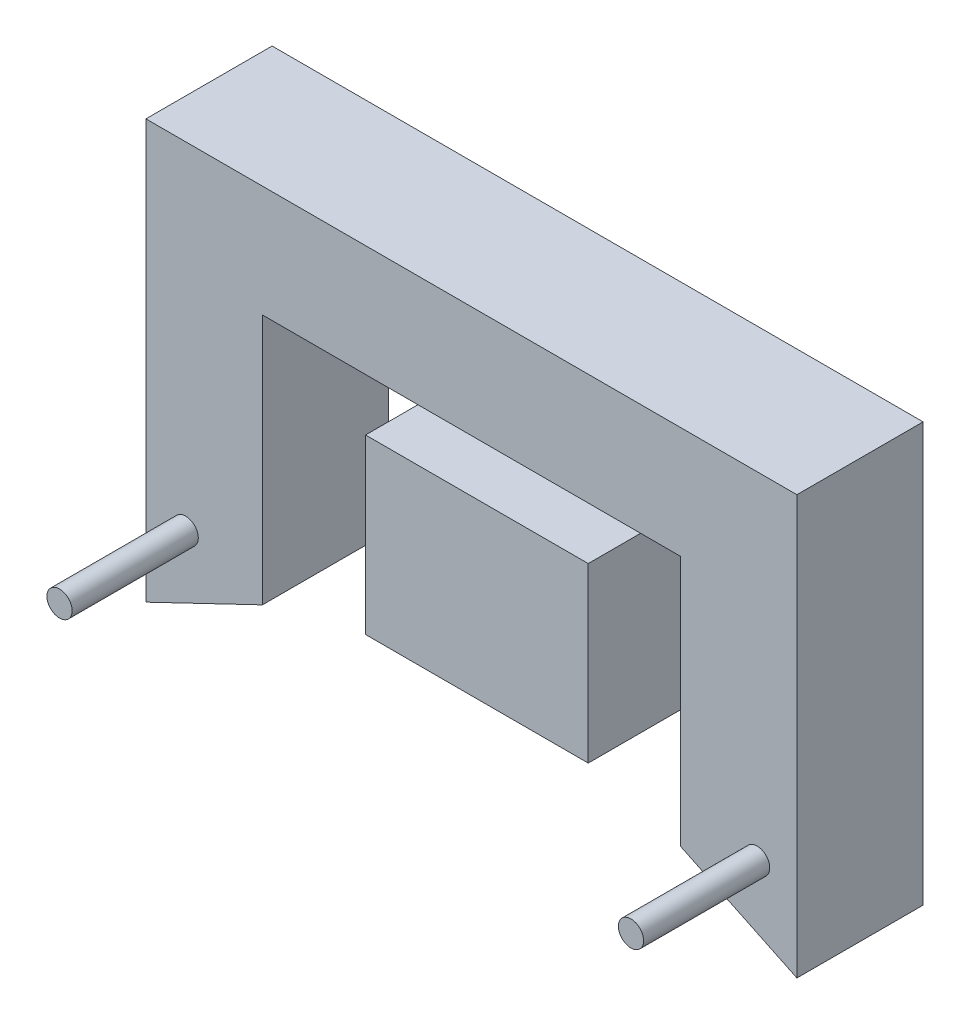
ISO-10303-21;
HEADER;
FILE_DESCRIPTION(('STEP AP214'),'2;1');
FILE_NAME('part.step','',(''),(''),'','','');
FILE_SCHEMA(('AUTOMOTIVE_DESIGN { 1 0 10303 214 1 1 1 1 }'));
ENDSEC;
DATA;
#1=APPLICATION_CONTEXT('core data for automotive mechanical design processes');
#2=APPLICATION_PROTOCOL_DEFINITION('international standard','automotive_design',2000,#1);
#3=PRODUCT_CONTEXT('',#1,'mechanical');
#4=PRODUCT('Part','Part','',(#3));
#5=PRODUCT_RELATED_PRODUCT_CATEGORY('part','',(#4));
#6=PRODUCT_DEFINITION_FORMATION('','',#4);
#7=PRODUCT_DEFINITION_CONTEXT('part definition',#1,'design');
#8=PRODUCT_DEFINITION('design','',#6,#7);
#9=PRODUCT_DEFINITION_SHAPE('','',#8);
#10=(LENGTH_UNIT() NAMED_UNIT(*) SI_UNIT(.MILLI.,.METRE.));
#11=(NAMED_UNIT(*) PLANE_ANGLE_UNIT() SI_UNIT($,.RADIAN.));
#12=(NAMED_UNIT(*) SI_UNIT($,.STERADIAN.) SOLID_ANGLE_UNIT());
#13=UNCERTAINTY_MEASURE_WITH_UNIT(LENGTH_MEASURE(1.E-05),#10,'distance_accuracy_value','');
#14=(GEOMETRIC_REPRESENTATION_CONTEXT(3) GLOBAL_UNCERTAINTY_ASSIGNED_CONTEXT((#13)) GLOBAL_UNIT_ASSIGNED_CONTEXT((#10,
#11,#12)) REPRESENTATION_CONTEXT('',''));
#15=CARTESIAN_POINT('',(0.,0.,0.));
#16=DIRECTION('',(0.,0.,1.));
#17=DIRECTION('',(1.,0.,0.));
#18=AXIS2_PLACEMENT_3D('',#15,#16,#17);
#19=CARTESIAN_POINT('',(-150.878326632198,35.1271833279846,20.));
#20=DIRECTION('',(1.,0.,0.));
#21=DIRECTION('',(0.,0.,-1.));
#22=AXIS2_PLACEMENT_3D('',#19,#20,#21);
#23=PLANE('',#22);
#24=DIRECTION('',(0.,-1.,0.));
#25=VECTOR('',#24,1.);
#26=CARTESIAN_POINT('',(-150.878326632198,35.1271833279846,0.));
#27=LINE('',#26,#25);
#28=CARTESIAN_POINT('',(-150.878326632198,35.1271833279846,0.));
#29=VERTEX_POINT('',#28);
#30=CARTESIAN_POINT('',(-150.878326632198,7.73369103403253,0.));
#31=VERTEX_POINT('',#30);
#32=EDGE_CURVE('E161',#29,#31,#27,.T.);
#33=ORIENTED_EDGE('',*,*,#32,.T.);
#34=DIRECTION('',(0.,0.,-1.));
#35=VECTOR('',#34,1.);
#36=CARTESIAN_POINT('',(-150.878326632198,7.73369103403253,20.));
#37=LINE('',#36,#35);
#38=CARTESIAN_POINT('',(-150.878326632198,7.73369103403253,20.));
#39=VERTEX_POINT('',#38);
#40=EDGE_CURVE('E13',#39,#31,#37,.T.);
#41=ORIENTED_EDGE('',*,*,#40,.F.);
#42=DIRECTION('',(0.,-1.,0.));
#43=VECTOR('',#42,1.);
#44=CARTESIAN_POINT('',(-150.878326632198,35.1271833279846,20.));
#45=LINE('',#44,#43);
#46=CARTESIAN_POINT('',(-150.878326632198,35.1271833279846,20.));
#47=VERTEX_POINT('',#46);
#48=EDGE_CURVE('E147',#47,#39,#45,.T.);
#49=ORIENTED_EDGE('',*,*,#48,.F.);
#50=DIRECTION('',(0.,0.,-1.));
#51=VECTOR('',#50,1.);
#52=CARTESIAN_POINT('',(-150.878326632198,35.1271833279846,20.));
#53=LINE('',#52,#51);
#54=EDGE_CURVE('E114',#47,#29,#53,.T.);
#55=ORIENTED_EDGE('',*,*,#54,.T.);
#56=EDGE_LOOP('',(#33,#41,#49,#55));
#57=FACE_BOUND('',#56,.T.);
#58=ADVANCED_FACE('F98',(#57),#23,.F.);
#59=CARTESIAN_POINT('',(-150.878326632198,7.73369103403253,20.));
#60=DIRECTION('',(0.,1.,0.));
#61=DIRECTION('',(0.,0.,1.));
#62=AXIS2_PLACEMENT_3D('',#59,#60,#61);
#63=PLANE('',#62);
#64=DIRECTION('',(1.,0.,0.));
#65=VECTOR('',#64,1.);
#66=CARTESIAN_POINT('',(-150.878326632198,7.73369103403253,0.));
#67=LINE('',#66,#65);
#68=CARTESIAN_POINT('',(-115.579705041076,7.73369103403253,0.));
#69=VERTEX_POINT('',#68);
#70=EDGE_CURVE('E152',#31,#69,#67,.T.);
#71=ORIENTED_EDGE('',*,*,#70,.T.);
#72=DIRECTION('',(0.,0.,-1.));
#73=VECTOR('',#72,1.);
#74=CARTESIAN_POINT('',(-115.579705041076,7.73369103403253,20.));
#75=LINE('',#74,#73);
#76=CARTESIAN_POINT('',(-115.579705041076,7.73369103403253,20.));
#77=VERTEX_POINT('',#76);
#78=EDGE_CURVE('E106',#77,#69,#75,.T.);
#79=ORIENTED_EDGE('',*,*,#78,.F.);
#80=DIRECTION('',(1.,0.,0.));
#81=VECTOR('',#80,1.);
#82=CARTESIAN_POINT('',(-150.878326632198,7.73369103403253,20.));
#83=LINE('',#82,#81);
#84=EDGE_CURVE('E139',#39,#77,#83,.T.);
#85=ORIENTED_EDGE('',*,*,#84,.F.);
#86=ORIENTED_EDGE('',*,*,#40,.T.);
#87=EDGE_LOOP('',(#71,#79,#85,#86));
#88=FACE_BOUND('',#87,.T.);
#89=ADVANCED_FACE('F151',(#88),#63,.F.);
#90=CARTESIAN_POINT('',(-115.579705041076,35.1271833279846,20.));
#91=DIRECTION('',(1.,0.,0.));
#92=DIRECTION('',(0.,0.,-1.));
#93=AXIS2_PLACEMENT_3D('',#90,#91,#92);
#94=PLANE('',#93);
#95=DIRECTION('',(0.,-1.,0.));
#96=VECTOR('',#95,1.);
#97=CARTESIAN_POINT('',(-115.579705041076,35.1271833279846,0.));
#98=LINE('',#97,#96);
#99=CARTESIAN_POINT('',(-115.579705041076,35.1271833279846,0.));
#100=VERTEX_POINT('',#99);
#101=EDGE_CURVE('E164',#100,#69,#98,.T.);
#102=ORIENTED_EDGE('',*,*,#101,.F.);
#103=DIRECTION('',(0.,0.,-1.));
#104=VECTOR('',#103,1.);
#105=CARTESIAN_POINT('',(-115.579705041076,35.1271833279846,20.));
#106=LINE('',#105,#104);
#107=CARTESIAN_POINT('',(-115.579705041076,35.1271833279846,20.));
#108=VERTEX_POINT('',#107);
#109=EDGE_CURVE('E128',#108,#100,#106,.T.);
#110=ORIENTED_EDGE('',*,*,#109,.F.);
#111=DIRECTION('',(0.,-1.,0.));
#112=VECTOR('',#111,1.);
#113=CARTESIAN_POINT('',(-115.579705041076,35.1271833279846,20.));
#114=LINE('',#113,#112);
#115=EDGE_CURVE('E146',#108,#77,#114,.T.);
#116=ORIENTED_EDGE('',*,*,#115,.T.);
#117=ORIENTED_EDGE('',*,*,#78,.T.);
#118=EDGE_LOOP('',(#102,#110,#116,#117));
#119=FACE_BOUND('',#118,.T.);
#120=ADVANCED_FACE('F155',(#119),#94,.T.);
#121=CARTESIAN_POINT('',(-150.878326632198,35.1271833279846,20.));
#122=DIRECTION('',(0.,1.,0.));
#123=DIRECTION('',(0.,0.,1.));
#124=AXIS2_PLACEMENT_3D('',#121,#122,#123);
#125=PLANE('',#124);
#126=DIRECTION('',(1.,0.,0.));
#127=VECTOR('',#126,1.);
#128=CARTESIAN_POINT('',(-150.878326632198,35.1271833279846,0.));
#129=LINE('',#128,#127);
#130=EDGE_CURVE('E166',#29,#100,#129,.T.);
#131=ORIENTED_EDGE('',*,*,#130,.F.);
#132=ORIENTED_EDGE('',*,*,#54,.F.);
#133=DIRECTION('',(1.,0.,0.));
#134=VECTOR('',#133,1.);
#135=CARTESIAN_POINT('',(-150.878326632198,35.1271833279846,20.));
#136=LINE('',#135,#134);
#137=EDGE_CURVE('E156',#47,#108,#136,.T.);
#138=ORIENTED_EDGE('',*,*,#137,.T.);
#139=ORIENTED_EDGE('',*,*,#109,.T.);
#140=EDGE_LOOP('',(#131,#132,#138,#139));
#141=FACE_BOUND('',#140,.T.);
#142=ADVANCED_FACE('F172',(#141),#125,.T.);
#143=CARTESIAN_POINT('',(0.,0.,20.));
#144=DIRECTION('',(0.,0.,1.));
#145=DIRECTION('',(1.,0.,0.));
#146=AXIS2_PLACEMENT_3D('',#143,#144,#145);
#147=PLANE('',#146);
#148=ORIENTED_EDGE('',*,*,#48,.T.);
#149=ORIENTED_EDGE('',*,*,#84,.T.);
#150=ORIENTED_EDGE('',*,*,#115,.F.);
#151=ORIENTED_EDGE('',*,*,#137,.F.);
#152=EDGE_LOOP('',(#148,#149,#150,#151));
#153=FACE_BOUND('',#152,.T.);
#154=ADVANCED_FACE('F143',(#153),#147,.T.);
#155=CARTESIAN_POINT('',(0.,0.,0.));
#156=DIRECTION('',(0.,0.,1.));
#157=DIRECTION('',(1.,0.,0.));
#158=AXIS2_PLACEMENT_3D('',#155,#156,#157);
#159=PLANE('',#158);
#160=ORIENTED_EDGE('',*,*,#32,.F.);
#161=ORIENTED_EDGE('',*,*,#130,.T.);
#162=ORIENTED_EDGE('',*,*,#101,.T.);
#163=ORIENTED_EDGE('',*,*,#70,.F.);
#164=EDGE_LOOP('',(#160,#161,#162,#163));
#165=FACE_BOUND('',#164,.T.);
#166=ADVANCED_FACE('F171',(#165),#159,.F.);
#167=CLOSED_SHELL('',(#58,#89,#120,#142,#154,#166));
#168=MANIFOLD_SOLID_BREP('B2',#167);
#169=CARTESIAN_POINT('',(-88.8039762419996,7.73369103403253,40.));
#170=DIRECTION('',(0.,0.,-1.));
#171=DIRECTION('',(-1.,0.,0.));
#172=AXIS2_PLACEMENT_3D('',#169,#170,#171);
#173=CYLINDRICAL_SURFACE('',#172,2.00000000000001);
#174=CARTESIAN_POINT('',(-88.8039762419996,7.73369103403253,40.));
#175=DIRECTION('',(0.,0.,1.));
#176=DIRECTION('',(1.,0.,0.));
#177=AXIS2_PLACEMENT_3D('',#174,#175,#176);
#178=CIRCLE('',#177,2.00000000000001);
#179=CARTESIAN_POINT('',(-90.8039762419996,7.73369103403253,40.));
#180=VERTEX_POINT('',#179);
#181=EDGE_CURVE('E97',#180,#180,#178,.T.);
#182=CARTESIAN_POINT('',(-88.8039762419996,7.73369103403253,20.));
#183=DIRECTION('',(0.,0.,1.));
#184=DIRECTION('',(1.,0.,0.));
#185=AXIS2_PLACEMENT_3D('',#182,#183,#184);
#186=CIRCLE('',#185,2.00000000000001);
#187=CARTESIAN_POINT('',(-90.8039762419996,7.73369103403253,20.));
#188=VERTEX_POINT('',#187);
#189=EDGE_CURVE('E234',#188,#188,#186,.T.);
#190=CARTESIAN_POINT('',(-90.8039762419996,7.73369103403253,40.));
#191=CARTESIAN_POINT('',(-90.8039762419996,7.73369103403253,39.7916666666666));
#192=CARTESIAN_POINT('',(-90.8039762419996,7.73369103403253,39.5833333333333));
#193=CARTESIAN_POINT('',(-90.8039762419996,7.73369103403253,39.1666666666667));
#194=CARTESIAN_POINT('',(-90.8039762419996,7.73369103403253,38.9583333333333));
#195=CARTESIAN_POINT('',(-90.8039762419996,7.73369103403253,38.5416666666667));
#196=CARTESIAN_POINT('',(-90.8039762419996,7.73369103403253,38.3333333333333));
#197=CARTESIAN_POINT('',(-90.8039762419996,7.73369103403253,37.9166666666667));
#198=CARTESIAN_POINT('',(-90.8039762419996,7.73369103403253,37.7083333333333));
#199=CARTESIAN_POINT('',(-90.8039762419996,7.73369103403253,37.2916666666667));
#200=CARTESIAN_POINT('',(-90.8039762419996,7.73369103403253,37.0833333333333));
#201=CARTESIAN_POINT('',(-90.8039762419996,7.73369103403253,36.6666666666666));
#202=CARTESIAN_POINT('',(-90.8039762419996,7.73369103403253,36.4583333333333));
#203=CARTESIAN_POINT('',(-90.8039762419996,7.73369103403253,36.0416666666667));
#204=CARTESIAN_POINT('',(-90.8039762419996,7.73369103403253,35.8333333333333));
#205=CARTESIAN_POINT('',(-90.8039762419996,7.73369103403253,35.4166666666667));
#206=CARTESIAN_POINT('',(-90.8039762419996,7.73369103403253,35.2083333333333));
#207=CARTESIAN_POINT('',(-90.8039762419996,7.73369103403253,34.7916666666667));
#208=CARTESIAN_POINT('',(-90.8039762419996,7.73369103403253,34.5833333333333));
#209=CARTESIAN_POINT('',(-90.8039762419996,7.73369103403253,34.1666666666667));
#210=CARTESIAN_POINT('',(-90.8039762419996,7.73369103403253,33.9583333333333));
#211=CARTESIAN_POINT('',(-90.8039762419996,7.73369103403253,33.5416666666667));
#212=CARTESIAN_POINT('',(-90.8039762419996,7.73369103403253,33.3333333333333));
#213=CARTESIAN_POINT('',(-90.8039762419996,7.73369103403253,32.9166666666667));
#214=CARTESIAN_POINT('',(-90.8039762419996,7.73369103403253,32.7083333333333));
#215=CARTESIAN_POINT('',(-90.8039762419996,7.73369103403253,32.2916666666667));
#216=CARTESIAN_POINT('',(-90.8039762419996,7.73369103403253,32.0833333333333));
#217=CARTESIAN_POINT('',(-90.8039762419996,7.73369103403253,31.6666666666667));
#218=CARTESIAN_POINT('',(-90.8039762419996,7.73369103403253,31.4583333333333));
#219=CARTESIAN_POINT('',(-90.8039762419996,7.73369103403253,31.0416666666667));
#220=CARTESIAN_POINT('',(-90.8039762419996,7.73369103403253,30.8333333333333));
#221=CARTESIAN_POINT('',(-90.8039762419996,7.73369103403253,30.4166666666667));
#222=CARTESIAN_POINT('',(-90.8039762419996,7.73369103403253,30.2083333333333));
#223=CARTESIAN_POINT('',(-90.8039762419996,7.73369103403253,29.7916666666667));
#224=CARTESIAN_POINT('',(-90.8039762419996,7.73369103403253,29.5833333333333));
#225=CARTESIAN_POINT('',(-90.8039762419996,7.73369103403253,29.1666666666667));
#226=CARTESIAN_POINT('',(-90.8039762419996,7.73369103403253,28.9583333333333));
#227=CARTESIAN_POINT('',(-90.8039762419996,7.73369103403253,28.5416666666667));
#228=CARTESIAN_POINT('',(-90.8039762419996,7.73369103403253,28.3333333333333));
#229=CARTESIAN_POINT('',(-90.8039762419996,7.73369103403253,27.9166666666667));
#230=CARTESIAN_POINT('',(-90.8039762419996,7.73369103403253,27.7083333333333));
#231=CARTESIAN_POINT('',(-90.8039762419996,7.73369103403253,27.2916666666667));
#232=CARTESIAN_POINT('',(-90.8039762419996,7.73369103403253,27.0833333333333));
#233=CARTESIAN_POINT('',(-90.8039762419996,7.73369103403253,26.6666666666667));
#234=CARTESIAN_POINT('',(-90.8039762419996,7.73369103403253,26.4583333333333));
#235=CARTESIAN_POINT('',(-90.8039762419996,7.73369103403253,26.0416666666667));
#236=CARTESIAN_POINT('',(-90.8039762419996,7.73369103403253,25.8333333333333));
#237=CARTESIAN_POINT('',(-90.8039762419996,7.73369103403253,25.4166666666667));
#238=CARTESIAN_POINT('',(-90.8039762419996,7.73369103403253,25.2083333333333));
#239=CARTESIAN_POINT('',(-90.8039762419996,7.73369103403253,24.7916666666667));
#240=CARTESIAN_POINT('',(-90.8039762419996,7.73369103403253,24.5833333333333));
#241=CARTESIAN_POINT('',(-90.8039762419996,7.73369103403253,24.1666666666667));
#242=CARTESIAN_POINT('',(-90.8039762419996,7.73369103403253,23.9583333333333));
#243=CARTESIAN_POINT('',(-90.8039762419996,7.73369103403253,23.5416666666667));
#244=CARTESIAN_POINT('',(-90.8039762419996,7.73369103403253,23.3333333333333));
#245=CARTESIAN_POINT('',(-90.8039762419996,7.73369103403253,22.9166666666667));
#246=CARTESIAN_POINT('',(-90.8039762419996,7.73369103403253,22.7083333333333));
#247=CARTESIAN_POINT('',(-90.8039762419996,7.73369103403253,22.2916666666667));
#248=CARTESIAN_POINT('',(-90.8039762419996,7.73369103403253,22.0833333333333));
#249=CARTESIAN_POINT('',(-90.8039762419996,7.73369103403253,21.6666666666667));
#250=CARTESIAN_POINT('',(-90.8039762419996,7.73369103403253,21.4583333333333));
#251=CARTESIAN_POINT('',(-90.8039762419996,7.73369103403253,21.0416666666667));
#252=CARTESIAN_POINT('',(-90.8039762419996,7.73369103403253,20.8333333333333));
#253=CARTESIAN_POINT('',(-90.8039762419996,7.73369103403253,20.4166666666667));
#254=CARTESIAN_POINT('',(-90.8039762419996,7.73369103403253,20.2083333333333));
#255=CARTESIAN_POINT('',(-90.8039762419996,7.73369103403253,20.));
#256=B_SPLINE_CURVE_WITH_KNOTS('',3,(#190,#191,#192,#193,#194,#195,#196,#197,#198,#199,#200,
#201,#202,#203,#204,#205,#206,#207,#208,#209,#210,#211,#212,#213,#214,#215,#216,#217,#218,#219,
#220,#221,#222,#223,#224,#225,#226,#227,#228,#229,#230,#231,#232,#233,#234,#235,#236,#237,#238,
#239,#240,#241,#242,#243,#244,#245,#246,#247,#248,#249,#250,#251,#252,#253,#254,#255),
.UNSPECIFIED.,.F.,.F.,(4,2,2,2,2,2,2,2,2,2,2,2,2,2,2,2,2,2,2,2,2,2,2,2,2,2,2,2,2,2,2,2,4),(0.,
0.624999999999994,1.24999999999999,1.87499999999999,2.5,3.125,3.74999999999999,4.37499999999999,
4.99999999999999,5.62499999999999,6.24999999999999,6.87499999999998,7.49999999999999,
8.12499999999999,8.74999999999999,9.37499999999999,9.99999999999998,10.625,11.25,11.875,12.5,
13.125,13.75,14.375,15.,15.625,16.25,16.875,17.5,18.125,18.75,19.375,20.),.UNSPECIFIED.);
#257=EDGE_CURVE('BSEAM231',#180,#188,#256,.T.);
#258=ORIENTED_EDGE('',*,*,#181,.F.);
#259=ORIENTED_EDGE('',*,*,#189,.T.);
#260=ORIENTED_EDGE('',*,*,#257,.T.);
#261=ORIENTED_EDGE('',*,*,#257,.F.);
#262=EDGE_LOOP('',(#258,#260,#259,#261));
#263=FACE_BOUND('',#262,.T.);
#264=ADVANCED_FACE('F231',(#263),#173,.T.);
#265=CARTESIAN_POINT('',(-88.8039762419996,7.73369103403253,40.));
#266=DIRECTION('',(0.,0.,1.));
#267=DIRECTION('',(1.,0.,0.));
#268=AXIS2_PLACEMENT_3D('',#265,#266,#267);
#269=PLANE('',#268);
#270=ORIENTED_EDGE('',*,*,#181,.T.);
#271=EDGE_LOOP('',(#270));
#272=FACE_BOUND('',#271,.T.);
#273=ADVANCED_FACE('F246',(#272),#269,.T.);
#274=CARTESIAN_POINT('',(-88.8039762419996,7.73369103403253,20.));
#275=DIRECTION('',(0.,0.,1.));
#276=DIRECTION('',(1.,0.,0.));
#277=AXIS2_PLACEMENT_3D('',#274,#275,#276);
#278=PLANE('',#277);
#279=ORIENTED_EDGE('',*,*,#189,.F.);
#280=EDGE_LOOP('',(#279));
#281=FACE_BOUND('',#280,.T.);
#282=ADVANCED_FACE('F244',(#281),#278,.F.);
#283=CLOSED_SHELL('',(#264,#273,#282));
#284=MANIFOLD_SOLID_BREP('B7',#283);
#285=CARTESIAN_POINT('',(-179.389800334788,7.73369103403253,40.));
#286=DIRECTION('',(0.,0.,-1.));
#287=DIRECTION('',(-1.,0.,0.));
#288=AXIS2_PLACEMENT_3D('',#285,#286,#287);
#289=CYLINDRICAL_SURFACE('',#288,2.);
#290=CARTESIAN_POINT('',(-179.389800334788,7.73369103403253,40.));
#291=DIRECTION('',(0.,0.,1.));
#292=DIRECTION('',(1.,0.,0.));
#293=AXIS2_PLACEMENT_3D('',#290,#291,#292);
#294=CIRCLE('',#293,2.);
#295=CARTESIAN_POINT('',(-177.389800334788,7.73369103403253,40.));
#296=VERTEX_POINT('',#295);
#297=EDGE_CURVE('E230',#296,#296,#294,.T.);
#298=ORIENTED_EDGE('',*,*,#297,.F.);
#299=EDGE_LOOP('',(#298));
#300=FACE_BOUND('',#299,.T.);
#301=CARTESIAN_POINT('',(-179.389800334788,7.73369103403253,20.));
#302=DIRECTION('',(0.,0.,1.));
#303=DIRECTION('',(1.,0.,0.));
#304=AXIS2_PLACEMENT_3D('',#301,#302,#303);
#305=CIRCLE('',#304,2.);
#306=CARTESIAN_POINT('',(-177.389800334788,7.73369103403253,20.));
#307=VERTEX_POINT('',#306);
#308=EDGE_CURVE('E283',#307,#307,#305,.T.);
#309=ORIENTED_EDGE('',*,*,#308,.T.);
#310=EDGE_LOOP('',(#309));
#311=FACE_BOUND('',#310,.T.);
#312=ADVANCED_FACE('F280',(#300,#311),#289,.T.);
#313=CARTESIAN_POINT('',(-179.389800334788,7.73369103403253,40.));
#314=DIRECTION('',(0.,0.,1.));
#315=DIRECTION('',(1.,0.,0.));
#316=AXIS2_PLACEMENT_3D('',#313,#314,#315);
#317=PLANE('',#316);
#318=ORIENTED_EDGE('',*,*,#297,.T.);
#319=EDGE_LOOP('',(#318));
#320=FACE_BOUND('',#319,.T.);
#321=ADVANCED_FACE('F295',(#320),#317,.T.);
#322=CARTESIAN_POINT('',(-179.389800334788,7.73369103403253,20.));
#323=DIRECTION('',(0.,0.,1.));
#324=DIRECTION('',(1.,0.,0.));
#325=AXIS2_PLACEMENT_3D('',#322,#323,#324);
#326=PLANE('',#325);
#327=ORIENTED_EDGE('',*,*,#308,.F.);
#328=EDGE_LOOP('',(#327));
#329=FACE_BOUND('',#328,.T.);
#330=ADVANCED_FACE('F293',(#329),#326,.F.);
#331=CLOSED_SHELL('',(#312,#321,#330));
#332=MANIFOLD_SOLID_BREP('B92',#331);
#333=CARTESIAN_POINT('',(0.,0.,20.));
#334=DIRECTION('',(0.,0.,1.));
#335=DIRECTION('',(1.,0.,0.));
#336=AXIS2_PLACEMENT_3D('',#333,#334,#335);
#337=PLANE('',#336);
#338=CARTESIAN_POINT('',(-88.8039762419996,7.73369103403253,20.));
#339=DIRECTION('',(0.,0.,-1.));
#340=DIRECTION('',(-1.,0.,0.));
#341=AXIS2_PLACEMENT_3D('',#338,#339,#340);
#342=CIRCLE('',#341,2.);
#343=CARTESIAN_POINT('',(-90.8039762419996,7.73369103403253,20.));
#344=VERTEX_POINT('',#343);
#345=EDGE_CURVE('E469',#344,#344,#342,.T.);
#346=ORIENTED_EDGE('',*,*,#345,.T.);
#347=EDGE_LOOP('',(#346));
#348=FACE_BOUND('',#347,.T.);
#349=DIRECTION('',(0.901603662607114,0.432563100106144,0.));
#350=VECTOR('',#349,1.);
#351=CARTESIAN_POINT('',(-185.692642177939,-5.22843923623256,20.));
#352=LINE('',#351,#350);
#353=CARTESIAN_POINT('',(-185.692642177939,-5.22843923623256,20.));
#354=VERTEX_POINT('',#353);
#355=CARTESIAN_POINT('',(-167.219456565409,3.63445559084194,20.));
#356=VERTEX_POINT('',#355);
#357=EDGE_CURVE('E438',#354,#356,#352,.T.);
#358=ORIENTED_EDGE('',*,*,#357,.T.);
#359=DIRECTION('',(0.,1.,0.));
#360=VECTOR('',#359,1.);
#361=CARTESIAN_POINT('',(-167.219456565409,3.63445559084194,20.));
#362=LINE('',#361,#360);
#363=CARTESIAN_POINT('',(-167.219456565409,43.4324353888225,20.));
#364=VERTEX_POINT('',#363);
#365=EDGE_CURVE('E375',#356,#364,#362,.T.);
#366=ORIENTED_EDGE('',*,*,#365,.T.);
#367=DIRECTION('',(1.,0.,0.));
#368=VECTOR('',#367,1.);
#369=CARTESIAN_POINT('',(-167.219456565409,43.4324353888225,20.));
#370=LINE('',#369,#368);
#371=CARTESIAN_POINT('',(-100.974320011379,43.4324353888225,20.));
#372=VERTEX_POINT('',#371);
#373=EDGE_CURVE('E451',#364,#372,#370,.T.);
#374=ORIENTED_EDGE('',*,*,#373,.T.);
#375=DIRECTION('',(0.,1.,0.));
#376=VECTOR('',#375,1.);
#377=CARTESIAN_POINT('',(-100.974320011379,3.63445559084197,20.));
#378=LINE('',#377,#376);
#379=CARTESIAN_POINT('',(-100.974320011379,3.63445559084197,20.));
#380=VERTEX_POINT('',#379);
#381=EDGE_CURVE('E460',#380,#372,#378,.T.);
#382=ORIENTED_EDGE('',*,*,#381,.F.);
#383=DIRECTION('',(-0.901603662607114,0.432563100106144,0.));
#384=VECTOR('',#383,1.);
#385=CARTESIAN_POINT('',(-82.5011343988489,-5.22843923623255,20.));
#386=LINE('',#385,#384);
#387=CARTESIAN_POINT('',(-82.5011343988489,-5.22843923623255,20.));
#388=VERTEX_POINT('',#387);
#389=EDGE_CURVE('E400',#388,#380,#386,.T.);
#390=ORIENTED_EDGE('',*,*,#389,.F.);
#391=DIRECTION('',(0.,1.,0.));
#392=VECTOR('',#391,1.);
#393=CARTESIAN_POINT('',(-82.5011343988489,-5.22843923623255,20.));
#394=LINE('',#393,#392);
#395=CARTESIAN_POINT('',(-82.5011343988489,61.1182893836353,20.));
#396=VERTEX_POINT('',#395);
#397=EDGE_CURVE('E392',#388,#396,#394,.T.);
#398=ORIENTED_EDGE('',*,*,#397,.T.);
#399=DIRECTION('',(1.,0.,0.));
#400=VECTOR('',#399,1.);
#401=CARTESIAN_POINT('',(-185.692642177939,61.1182893836353,20.));
#402=LINE('',#401,#400);
#403=CARTESIAN_POINT('',(-185.692642177939,61.1182893836353,20.));
#404=VERTEX_POINT('',#403);
#405=EDGE_CURVE('E397',#404,#396,#402,.T.);
#406=ORIENTED_EDGE('',*,*,#405,.F.);
#407=DIRECTION('',(0.,1.,0.));
#408=VECTOR('',#407,1.);
#409=CARTESIAN_POINT('',(-185.692642177939,-5.22843923623256,20.));
#410=LINE('',#409,#408);
#411=EDGE_CURVE('E413',#354,#404,#410,.T.);
#412=ORIENTED_EDGE('',*,*,#411,.F.);
#413=EDGE_LOOP('',(#358,#366,#374,#382,#390,#398,#406,#412));
#414=FACE_BOUND('',#413,.T.);
#415=CARTESIAN_POINT('',(-179.389800334788,7.73369103403253,20.));
#416=DIRECTION('',(0.,0.,1.));
#417=DIRECTION('',(1.,0.,0.));
#418=AXIS2_PLACEMENT_3D('',#415,#416,#417);
#419=CIRCLE('',#418,2.);
#420=CARTESIAN_POINT('',(-177.389800334788,7.73369103403253,20.));
#421=VERTEX_POINT('',#420);
#422=EDGE_CURVE('E421',#421,#421,#419,.T.);
#423=ORIENTED_EDGE('',*,*,#422,.F.);
#424=EDGE_LOOP('',(#423));
#425=FACE_BOUND('',#424,.T.);
#426=ADVANCED_FACE('F320',(#348,#414,#425),#337,.T.);
#427=CARTESIAN_POINT('',(0.,0.,0.));
#428=DIRECTION('',(0.,0.,1.));
#429=DIRECTION('',(1.,0.,0.));
#430=AXIS2_PLACEMENT_3D('',#427,#428,#429);
#431=PLANE('',#430);
#432=CARTESIAN_POINT('',(-88.8039762419996,7.73369103403253,0.));
#433=DIRECTION('',(0.,0.,-1.));
#434=DIRECTION('',(-1.,0.,0.));
#435=AXIS2_PLACEMENT_3D('',#432,#433,#434);
#436=CIRCLE('',#435,2.);
#437=CARTESIAN_POINT('',(-90.8039762419996,7.73369103403253,0.));
#438=VERTEX_POINT('',#437);
#439=EDGE_CURVE('E472',#438,#438,#436,.T.);
#440=ORIENTED_EDGE('',*,*,#439,.F.);
#441=EDGE_LOOP('',(#440));
#442=FACE_BOUND('',#441,.T.);
#443=DIRECTION('',(0.901603662607114,0.432563100106144,0.));
#444=VECTOR('',#443,1.);
#445=CARTESIAN_POINT('',(-185.692642177939,-5.22843923623256,0.));
#446=LINE('',#445,#444);
#447=CARTESIAN_POINT('',(-185.692642177939,-5.22843923623256,0.));
#448=VERTEX_POINT('',#447);
#449=CARTESIAN_POINT('',(-167.219456565409,3.63445559084194,0.));
#450=VERTEX_POINT('',#449);
#451=EDGE_CURVE('E418',#448,#450,#446,.T.);
#452=ORIENTED_EDGE('',*,*,#451,.F.);
#453=DIRECTION('',(0.,1.,0.));
#454=VECTOR('',#453,1.);
#455=CARTESIAN_POINT('',(-185.692642177939,-5.22843923623256,0.));
#456=LINE('',#455,#454);
#457=CARTESIAN_POINT('',(-185.692642177939,61.1182893836353,0.));
#458=VERTEX_POINT('',#457);
#459=EDGE_CURVE('E435',#448,#458,#456,.T.);
#460=ORIENTED_EDGE('',*,*,#459,.T.);
#461=DIRECTION('',(1.,0.,0.));
#462=VECTOR('',#461,1.);
#463=CARTESIAN_POINT('',(-185.692642177939,61.1182893836353,0.));
#464=LINE('',#463,#462);
#465=CARTESIAN_POINT('',(-82.5011343988489,61.1182893836353,0.));
#466=VERTEX_POINT('',#465);
#467=EDGE_CURVE('E433',#458,#466,#464,.T.);
#468=ORIENTED_EDGE('',*,*,#467,.T.);
#469=DIRECTION('',(0.,1.,0.));
#470=VECTOR('',#469,1.);
#471=CARTESIAN_POINT('',(-82.5011343988489,-5.22843923623255,0.));
#472=LINE('',#471,#470);
#473=CARTESIAN_POINT('',(-82.5011343988489,-5.22843923623255,0.));
#474=VERTEX_POINT('',#473);
#475=EDGE_CURVE('E407',#474,#466,#472,.T.);
#476=ORIENTED_EDGE('',*,*,#475,.F.);
#477=DIRECTION('',(-0.901603662607114,0.432563100106144,0.));
#478=VECTOR('',#477,1.);
#479=CARTESIAN_POINT('',(-82.5011343988489,-5.22843923623255,0.));
#480=LINE('',#479,#478);
#481=CARTESIAN_POINT('',(-100.974320011379,3.63445559084197,0.));
#482=VERTEX_POINT('',#481);
#483=EDGE_CURVE('E429',#474,#482,#480,.T.);
#484=ORIENTED_EDGE('',*,*,#483,.T.);
#485=DIRECTION('',(0.,1.,0.));
#486=VECTOR('',#485,1.);
#487=CARTESIAN_POINT('',(-100.974320011379,3.63445559084197,0.));
#488=LINE('',#487,#486);
#489=CARTESIAN_POINT('',(-100.974320011379,43.4324353888225,0.));
#490=VERTEX_POINT('',#489);
#491=EDGE_CURVE('E426',#482,#490,#488,.T.);
#492=ORIENTED_EDGE('',*,*,#491,.T.);
#493=DIRECTION('',(1.,0.,0.));
#494=VECTOR('',#493,1.);
#495=CARTESIAN_POINT('',(-167.219456565409,43.4324353888225,0.));
#496=LINE('',#495,#494);
#497=CARTESIAN_POINT('',(-167.219456565409,43.4324353888225,0.));
#498=VERTEX_POINT('',#497);
#499=EDGE_CURVE('E423',#498,#490,#496,.T.);
#500=ORIENTED_EDGE('',*,*,#499,.F.);
#501=DIRECTION('',(0.,1.,0.));
#502=VECTOR('',#501,1.);
#503=CARTESIAN_POINT('',(-167.219456565409,3.63445559084194,0.));
#504=LINE('',#503,#502);
#505=EDGE_CURVE('E420',#450,#498,#504,.T.);
#506=ORIENTED_EDGE('',*,*,#505,.F.);
#507=EDGE_LOOP('',(#452,#460,#468,#476,#484,#492,#500,#506));
#508=FACE_BOUND('',#507,.T.);
#509=CARTESIAN_POINT('',(-179.389800334788,7.73369103403253,0.));
#510=DIRECTION('',(0.,0.,1.));
#511=DIRECTION('',(1.,0.,0.));
#512=AXIS2_PLACEMENT_3D('',#509,#510,#511);
#513=CIRCLE('',#512,2.);
#514=CARTESIAN_POINT('',(-177.389800334788,7.73369103403253,0.));
#515=VERTEX_POINT('',#514);
#516=EDGE_CURVE('E466',#515,#515,#513,.T.);
#517=ORIENTED_EDGE('',*,*,#516,.T.);
#518=EDGE_LOOP('',(#517));
#519=FACE_BOUND('',#518,.T.);
#520=ADVANCED_FACE('F453',(#442,#508,#519),#431,.F.);
#521=CARTESIAN_POINT('',(-185.692642177939,-5.22843923623256,20.));
#522=DIRECTION('',(-0.432563100106144,0.901603662607114,0.));
#523=DIRECTION('',(-0.901603662607114,-0.432563100106144,0.));
#524=AXIS2_PLACEMENT_3D('',#521,#522,#523);
#525=PLANE('',#524);
#526=ORIENTED_EDGE('',*,*,#451,.T.);
#527=DIRECTION('',(0.,0.,-1.));
#528=VECTOR('',#527,1.);
#529=CARTESIAN_POINT('',(-167.219456565409,3.63445559084194,20.));
#530=LINE('',#529,#528);
#531=EDGE_CURVE('E278',#356,#450,#530,.T.);
#532=ORIENTED_EDGE('',*,*,#531,.F.);
#533=ORIENTED_EDGE('',*,*,#357,.F.);
#534=DIRECTION('',(0.,0.,-1.));
#535=VECTOR('',#534,1.);
#536=CARTESIAN_POINT('',(-185.692642177939,-5.22843923623256,20.));
#537=LINE('',#536,#535);
#538=EDGE_CURVE('E337',#354,#448,#537,.T.);
#539=ORIENTED_EDGE('',*,*,#538,.T.);
#540=EDGE_LOOP('',(#526,#532,#533,#539));
#541=FACE_BOUND('',#540,.T.);
#542=ADVANCED_FACE('F322',(#541),#525,.F.);
#543=CARTESIAN_POINT('',(-167.219456565409,3.63445559084194,20.));
#544=DIRECTION('',(-1.,0.,0.));
#545=DIRECTION('',(0.,0.,1.));
#546=AXIS2_PLACEMENT_3D('',#543,#544,#545);
#547=PLANE('',#546);
#548=ORIENTED_EDGE('',*,*,#505,.T.);
#549=DIRECTION('',(0.,0.,-1.));
#550=VECTOR('',#549,1.);
#551=CARTESIAN_POINT('',(-167.219456565409,43.4324353888225,20.));
#552=LINE('',#551,#550);
#553=EDGE_CURVE('E329',#364,#498,#552,.T.);
#554=ORIENTED_EDGE('',*,*,#553,.F.);
#555=ORIENTED_EDGE('',*,*,#365,.F.);
#556=ORIENTED_EDGE('',*,*,#531,.T.);
#557=EDGE_LOOP('',(#548,#554,#555,#556));
#558=FACE_BOUND('',#557,.T.);
#559=ADVANCED_FACE('F492',(#558),#547,.F.);
#560=CARTESIAN_POINT('',(-167.219456565409,43.4324353888225,20.));
#561=DIRECTION('',(0.,1.,0.));
#562=DIRECTION('',(0.,0.,1.));
#563=AXIS2_PLACEMENT_3D('',#560,#561,#562);
#564=PLANE('',#563);
#565=ORIENTED_EDGE('',*,*,#499,.T.);
#566=DIRECTION('',(0.,0.,-1.));
#567=VECTOR('',#566,1.);
#568=CARTESIAN_POINT('',(-100.974320011379,43.4324353888225,20.));
#569=LINE('',#568,#567);
#570=EDGE_CURVE('E444',#372,#490,#569,.T.);
#571=ORIENTED_EDGE('',*,*,#570,.F.);
#572=ORIENTED_EDGE('',*,*,#373,.F.);
#573=ORIENTED_EDGE('',*,*,#553,.T.);
#574=EDGE_LOOP('',(#565,#571,#572,#573));
#575=FACE_BOUND('',#574,.T.);
#576=ADVANCED_FACE('F449',(#575),#564,.F.);
#577=CARTESIAN_POINT('',(-100.974320011379,3.63445559084197,20.));
#578=DIRECTION('',(-1.,0.,0.));
#579=DIRECTION('',(0.,0.,1.));
#580=AXIS2_PLACEMENT_3D('',#577,#578,#579);
#581=PLANE('',#580);
#582=ORIENTED_EDGE('',*,*,#491,.F.);
#583=DIRECTION('',(0.,0.,-1.));
#584=VECTOR('',#583,1.);
#585=CARTESIAN_POINT('',(-100.974320011379,3.63445559084197,20.));
#586=LINE('',#585,#584);
#587=EDGE_CURVE('E442',#380,#482,#586,.T.);
#588=ORIENTED_EDGE('',*,*,#587,.F.);
#589=ORIENTED_EDGE('',*,*,#381,.T.);
#590=ORIENTED_EDGE('',*,*,#570,.T.);
#591=EDGE_LOOP('',(#582,#588,#589,#590));
#592=FACE_BOUND('',#591,.T.);
#593=ADVANCED_FACE('F458',(#592),#581,.T.);
#594=CARTESIAN_POINT('',(-82.5011343988489,-5.22843923623255,20.));
#595=DIRECTION('',(-0.432563100106144,-0.901603662607114,0.));
#596=DIRECTION('',(0.901603662607114,-0.432563100106144,0.));
#597=AXIS2_PLACEMENT_3D('',#594,#595,#596);
#598=PLANE('',#597);
#599=ORIENTED_EDGE('',*,*,#483,.F.);
#600=DIRECTION('',(0.,0.,-1.));
#601=VECTOR('',#600,1.);
#602=CARTESIAN_POINT('',(-82.5011343988489,-5.22843923623255,20.));
#603=LINE('',#602,#601);
#604=EDGE_CURVE('E410',#388,#474,#603,.T.);
#605=ORIENTED_EDGE('',*,*,#604,.F.);
#606=ORIENTED_EDGE('',*,*,#389,.T.);
#607=ORIENTED_EDGE('',*,*,#587,.T.);
#608=EDGE_LOOP('',(#599,#605,#606,#607));
#609=FACE_BOUND('',#608,.T.);
#610=ADVANCED_FACE('F503',(#609),#598,.T.);
#611=CARTESIAN_POINT('',(-82.5011343988489,-5.22843923623255,20.));
#612=DIRECTION('',(-1.,0.,0.));
#613=DIRECTION('',(0.,0.,1.));
#614=AXIS2_PLACEMENT_3D('',#611,#612,#613);
#615=PLANE('',#614);
#616=ORIENTED_EDGE('',*,*,#475,.T.);
#617=DIRECTION('',(0.,0.,-1.));
#618=VECTOR('',#617,1.);
#619=CARTESIAN_POINT('',(-82.5011343988489,61.1182893836353,20.));
#620=LINE('',#619,#618);
#621=EDGE_CURVE('E404',#396,#466,#620,.T.);
#622=ORIENTED_EDGE('',*,*,#621,.F.);
#623=ORIENTED_EDGE('',*,*,#397,.F.);
#624=ORIENTED_EDGE('',*,*,#604,.T.);
#625=EDGE_LOOP('',(#616,#622,#623,#624));
#626=FACE_BOUND('',#625,.T.);
#627=ADVANCED_FACE('F405',(#626),#615,.F.);
#628=CARTESIAN_POINT('',(-185.692642177939,61.1182893836353,20.));
#629=DIRECTION('',(0.,1.,0.));
#630=DIRECTION('',(0.,0.,1.));
#631=AXIS2_PLACEMENT_3D('',#628,#629,#630);
#632=PLANE('',#631);
#633=ORIENTED_EDGE('',*,*,#467,.F.);
#634=DIRECTION('',(0.,0.,-1.));
#635=VECTOR('',#634,1.);
#636=CARTESIAN_POINT('',(-185.692642177939,61.1182893836353,20.));
#637=LINE('',#636,#635);
#638=EDGE_CURVE('E363',#404,#458,#637,.T.);
#639=ORIENTED_EDGE('',*,*,#638,.F.);
#640=ORIENTED_EDGE('',*,*,#405,.T.);
#641=ORIENTED_EDGE('',*,*,#621,.T.);
#642=EDGE_LOOP('',(#633,#639,#640,#641));
#643=FACE_BOUND('',#642,.T.);
#644=ADVANCED_FACE('F412',(#643),#632,.T.);
#645=CARTESIAN_POINT('',(-185.692642177939,-5.22843923623256,20.));
#646=DIRECTION('',(-1.,0.,0.));
#647=DIRECTION('',(0.,0.,1.));
#648=AXIS2_PLACEMENT_3D('',#645,#646,#647);
#649=PLANE('',#648);
#650=ORIENTED_EDGE('',*,*,#459,.F.);
#651=ORIENTED_EDGE('',*,*,#538,.F.);
#652=ORIENTED_EDGE('',*,*,#411,.T.);
#653=ORIENTED_EDGE('',*,*,#638,.T.);
#654=EDGE_LOOP('',(#650,#651,#652,#653));
#655=FACE_BOUND('',#654,.T.);
#656=ADVANCED_FACE('F496',(#655),#649,.T.);
#657=CARTESIAN_POINT('',(-179.389800334788,7.73369103403253,20.));
#658=DIRECTION('',(0.,0.,-1.));
#659=DIRECTION('',(-1.,0.,0.));
#660=AXIS2_PLACEMENT_3D('',#657,#658,#659);
#661=CYLINDRICAL_SURFACE('',#660,2.);
#662=ORIENTED_EDGE('',*,*,#422,.T.);
#663=EDGE_LOOP('',(#662));
#664=FACE_BOUND('',#663,.T.);
#665=ORIENTED_EDGE('',*,*,#516,.F.);
#666=EDGE_LOOP('',(#665));
#667=FACE_BOUND('',#666,.T.);
#668=ADVANCED_FACE('F482',(#664,#667),#661,.F.);
#669=CARTESIAN_POINT('',(-88.8039762419996,7.73369103403253,20.));
#670=DIRECTION('',(0.,0.,-1.));
#671=DIRECTION('',(-1.,0.,0.));
#672=AXIS2_PLACEMENT_3D('',#669,#670,#671);
#673=CYLINDRICAL_SURFACE('',#672,2.);
#674=ORIENTED_EDGE('',*,*,#345,.F.);
#675=EDGE_LOOP('',(#674));
#676=FACE_BOUND('',#675,.T.);
#677=ORIENTED_EDGE('',*,*,#439,.T.);
#678=EDGE_LOOP('',(#677));
#679=FACE_BOUND('',#678,.T.);
#680=ADVANCED_FACE('F479',(#676,#679),#673,.F.);
#681=CLOSED_SHELL('',(#426,#520,#542,#559,#576,#593,#610,#627,#644,#656,#668,#680));
#682=MANIFOLD_SOLID_BREP('B225',#681);
#683=ADVANCED_BREP_SHAPE_REPRESENTATION('',(#18,#168,#284,#332,#682),#14);
#684=SHAPE_DEFINITION_REPRESENTATION(#9,#683);
ENDSEC;
END-ISO-10303-21;
